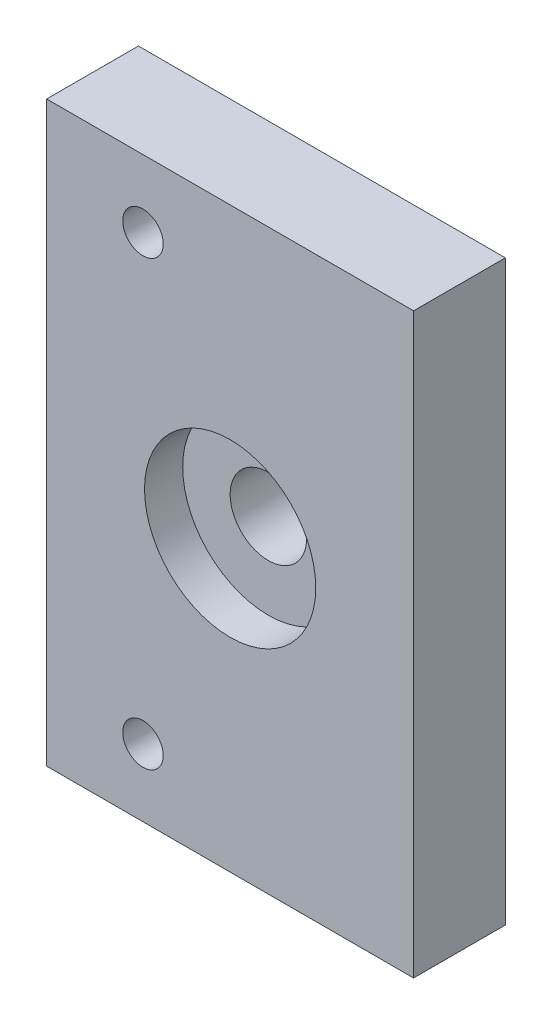
ISO-10303-21;
HEADER;
FILE_DESCRIPTION(('STEP AP214'),'2;1');
FILE_NAME('part.step','',(''),(''),'','','');
FILE_SCHEMA(('AUTOMOTIVE_DESIGN { 1 0 10303 214 1 1 1 1 }'));
ENDSEC;
DATA;
#1=APPLICATION_CONTEXT('core data for automotive mechanical design processes');
#2=APPLICATION_PROTOCOL_DEFINITION('international standard','automotive_design',2000,#1);
#3=PRODUCT_CONTEXT('',#1,'mechanical');
#4=PRODUCT('Part','Part','',(#3));
#5=PRODUCT_RELATED_PRODUCT_CATEGORY('part','',(#4));
#6=PRODUCT_DEFINITION_FORMATION('','',#4);
#7=PRODUCT_DEFINITION_CONTEXT('part definition',#1,'design');
#8=PRODUCT_DEFINITION('design','',#6,#7);
#9=PRODUCT_DEFINITION_SHAPE('','',#8);
#10=(LENGTH_UNIT() NAMED_UNIT(*) SI_UNIT(.MILLI.,.METRE.));
#11=(NAMED_UNIT(*) PLANE_ANGLE_UNIT() SI_UNIT($,.RADIAN.));
#12=(NAMED_UNIT(*) SI_UNIT($,.STERADIAN.) SOLID_ANGLE_UNIT());
#13=UNCERTAINTY_MEASURE_WITH_UNIT(LENGTH_MEASURE(1.E-05),#10,'distance_accuracy_value','');
#14=(GEOMETRIC_REPRESENTATION_CONTEXT(3) GLOBAL_UNCERTAINTY_ASSIGNED_CONTEXT((#13)) GLOBAL_UNIT_ASSIGNED_CONTEXT((#10,
#11,#12)) REPRESENTATION_CONTEXT('',''));
#15=CARTESIAN_POINT('',(0.,0.,0.));
#16=DIRECTION('',(0.,0.,1.));
#17=DIRECTION('',(1.,0.,0.));
#18=AXIS2_PLACEMENT_3D('',#15,#16,#17);
#19=CARTESIAN_POINT('',(0.,-29.9999999999999,5.55752));
#20=DIRECTION('',(0.,1.,0.));
#21=DIRECTION('',(-1.,0.,0.));
#22=AXIS2_PLACEMENT_3D('',#19,#20,#21);
#23=PLANE('',#22);
#24=DIRECTION('',(1.,0.,0.));
#25=VECTOR('',#24,1.);
#26=CARTESIAN_POINT('',(0.,-29.9999999999999,0.));
#27=LINE('',#26,#25);
#28=CARTESIAN_POINT('',(-295.275,-30.,0.));
#29=VERTEX_POINT('',#28);
#30=CARTESIAN_POINT('',(-257.175,-30.,0.));
#31=VERTEX_POINT('',#30);
#32=EDGE_CURVE('E87',#29,#31,#27,.T.);
#33=ORIENTED_EDGE('',*,*,#32,.T.);
#34=DIRECTION('',(0.,0.,-1.));
#35=VECTOR('',#34,1.);
#36=CARTESIAN_POINT('',(-257.175,-30.,5.55752));
#37=LINE('',#36,#35);
#38=CARTESIAN_POINT('',(-257.175,-30.,9.525));
#39=VERTEX_POINT('',#38);
#40=EDGE_CURVE('E44',#39,#31,#37,.T.);
#41=ORIENTED_EDGE('',*,*,#40,.F.);
#42=DIRECTION('',(1.,0.,0.));
#43=VECTOR('',#42,1.);
#44=CARTESIAN_POINT('',(0.,-29.9999999999999,9.525));
#45=LINE('',#44,#43);
#46=CARTESIAN_POINT('',(-295.275,-30.,9.525));
#47=VERTEX_POINT('',#46);
#48=EDGE_CURVE('E85',#47,#39,#45,.T.);
#49=ORIENTED_EDGE('',*,*,#48,.F.);
#50=DIRECTION('',(0.,0.,-1.));
#51=VECTOR('',#50,1.);
#52=CARTESIAN_POINT('',(-295.275,-30.,5.55752));
#53=LINE('',#52,#51);
#54=EDGE_CURVE('E57',#47,#29,#53,.T.);
#55=ORIENTED_EDGE('',*,*,#54,.T.);
#56=EDGE_LOOP('',(#33,#41,#49,#55));
#57=FACE_BOUND('',#56,.T.);
#58=ADVANCED_FACE('F41',(#57),#23,.F.);
#59=CARTESIAN_POINT('',(-257.175,0.,5.55752));
#60=DIRECTION('',(-1.,0.,0.));
#61=DIRECTION('',(0.,0.,1.));
#62=AXIS2_PLACEMENT_3D('',#59,#60,#61);
#63=PLANE('',#62);
#64=DIRECTION('',(0.,1.,0.));
#65=VECTOR('',#64,1.);
#66=CARTESIAN_POINT('',(-257.175,0.,0.));
#67=LINE('',#66,#65);
#68=CARTESIAN_POINT('',(-257.175,30.,0.));
#69=VERTEX_POINT('',#68);
#70=EDGE_CURVE('E124',#31,#69,#67,.T.);
#71=ORIENTED_EDGE('',*,*,#70,.T.);
#72=DIRECTION('',(0.,0.,-1.));
#73=VECTOR('',#72,1.);
#74=CARTESIAN_POINT('',(-257.175,30.,5.55752));
#75=LINE('',#74,#73);
#76=CARTESIAN_POINT('',(-257.175,30.,9.525));
#77=VERTEX_POINT('',#76);
#78=EDGE_CURVE('E91',#77,#69,#75,.T.);
#79=ORIENTED_EDGE('',*,*,#78,.F.);
#80=DIRECTION('',(0.,1.,0.));
#81=VECTOR('',#80,1.);
#82=CARTESIAN_POINT('',(-257.175,0.,9.525));
#83=LINE('',#82,#81);
#84=EDGE_CURVE('E93',#39,#77,#83,.T.);
#85=ORIENTED_EDGE('',*,*,#84,.F.);
#86=ORIENTED_EDGE('',*,*,#40,.T.);
#87=EDGE_LOOP('',(#71,#79,#85,#86));
#88=FACE_BOUND('',#87,.T.);
#89=ADVANCED_FACE('F94',(#88),#63,.F.);
#90=CARTESIAN_POINT('',(0.,30.,5.55752));
#91=DIRECTION('',(0.,1.,0.));
#92=DIRECTION('',(0.,0.,1.));
#93=AXIS2_PLACEMENT_3D('',#90,#91,#92);
#94=PLANE('',#93);
#95=DIRECTION('',(1.,0.,0.));
#96=VECTOR('',#95,1.);
#97=CARTESIAN_POINT('',(0.,30.,0.));
#98=LINE('',#97,#96);
#99=CARTESIAN_POINT('',(-295.275,30.,0.));
#100=VERTEX_POINT('',#99);
#101=EDGE_CURVE('E127',#100,#69,#98,.T.);
#102=ORIENTED_EDGE('',*,*,#101,.F.);
#103=DIRECTION('',(0.,0.,-1.));
#104=VECTOR('',#103,1.);
#105=CARTESIAN_POINT('',(-295.275,30.,5.55752));
#106=LINE('',#105,#104);
#107=CARTESIAN_POINT('',(-295.275,30.,9.525));
#108=VERTEX_POINT('',#107);
#109=EDGE_CURVE('E65',#108,#100,#106,.T.);
#110=ORIENTED_EDGE('',*,*,#109,.F.);
#111=DIRECTION('',(1.,0.,0.));
#112=VECTOR('',#111,1.);
#113=CARTESIAN_POINT('',(0.,30.,9.525));
#114=LINE('',#113,#112);
#115=EDGE_CURVE('E99',#108,#77,#114,.T.);
#116=ORIENTED_EDGE('',*,*,#115,.T.);
#117=ORIENTED_EDGE('',*,*,#78,.T.);
#118=EDGE_LOOP('',(#102,#110,#116,#117));
#119=FACE_BOUND('',#118,.T.);
#120=ADVANCED_FACE('F144',(#119),#94,.T.);
#121=CARTESIAN_POINT('',(-295.275,0.,5.55752));
#122=DIRECTION('',(-1.,0.,0.));
#123=DIRECTION('',(0.,0.,1.));
#124=AXIS2_PLACEMENT_3D('',#121,#122,#123);
#125=PLANE('',#124);
#126=DIRECTION('',(0.,1.,0.));
#127=VECTOR('',#126,1.);
#128=CARTESIAN_POINT('',(-295.275,0.,0.));
#129=LINE('',#128,#127);
#130=EDGE_CURVE('E131',#29,#100,#129,.T.);
#131=ORIENTED_EDGE('',*,*,#130,.F.);
#132=ORIENTED_EDGE('',*,*,#54,.F.);
#133=DIRECTION('',(0.,1.,0.));
#134=VECTOR('',#133,1.);
#135=CARTESIAN_POINT('',(-295.275,0.,9.525));
#136=LINE('',#135,#134);
#137=EDGE_CURVE('E102',#47,#108,#136,.T.);
#138=ORIENTED_EDGE('',*,*,#137,.T.);
#139=ORIENTED_EDGE('',*,*,#109,.T.);
#140=EDGE_LOOP('',(#131,#132,#138,#139));
#141=FACE_BOUND('',#140,.T.);
#142=ADVANCED_FACE('F147',(#141),#125,.T.);
#143=CARTESIAN_POINT('',(-276.225,0.,5.55752));
#144=DIRECTION('',(0.,0.,-1.));
#145=DIRECTION('',(-1.,0.,0.));
#146=AXIS2_PLACEMENT_3D('',#143,#144,#145);
#147=CYLINDRICAL_SURFACE('',#146,3.96875000000005);
#148=CARTESIAN_POINT('',(-276.225,0.,5.55752));
#149=DIRECTION('',(0.,0.,1.));
#150=DIRECTION('',(1.,0.,0.));
#151=AXIS2_PLACEMENT_3D('',#148,#149,#150);
#152=CIRCLE('',#151,3.96875000000005);
#153=CARTESIAN_POINT('',(-280.19375,0.,5.55752));
#154=VERTEX_POINT('',#153);
#155=EDGE_CURVE('E117',#154,#154,#152,.T.);
#156=CARTESIAN_POINT('',(-276.225,0.,0.));
#157=DIRECTION('',(0.,0.,1.));
#158=DIRECTION('',(1.,0.,0.));
#159=AXIS2_PLACEMENT_3D('',#156,#157,#158);
#160=CIRCLE('',#159,3.96875000000005);
#161=CARTESIAN_POINT('',(-280.19375,0.,0.));
#162=VERTEX_POINT('',#161);
#163=EDGE_CURVE('E121',#162,#162,#160,.T.);
#164=CARTESIAN_POINT('',(-280.19375,0.,5.55752));
#165=CARTESIAN_POINT('',(-280.19375,0.,5.49962916666667));
#166=CARTESIAN_POINT('',(-280.19375,0.,5.44173833333333));
#167=CARTESIAN_POINT('',(-280.19375,0.,5.32595666666667));
#168=CARTESIAN_POINT('',(-280.19375,0.,5.26806583333333));
#169=CARTESIAN_POINT('',(-280.19375,0.,5.15228416666667));
#170=CARTESIAN_POINT('',(-280.19375,0.,5.09439333333333));
#171=CARTESIAN_POINT('',(-280.19375,0.,4.97861166666667));
#172=CARTESIAN_POINT('',(-280.19375,0.,4.92072083333333));
#173=CARTESIAN_POINT('',(-280.19375,0.,4.80493916666667));
#174=CARTESIAN_POINT('',(-280.19375,0.,4.74704833333333));
#175=CARTESIAN_POINT('',(-280.19375,0.,4.63126666666667));
#176=CARTESIAN_POINT('',(-280.19375,0.,4.57337583333333));
#177=CARTESIAN_POINT('',(-280.19375,0.,4.45759416666667));
#178=CARTESIAN_POINT('',(-280.19375,0.,4.39970333333333));
#179=CARTESIAN_POINT('',(-280.19375,0.,4.28392166666667));
#180=CARTESIAN_POINT('',(-280.19375,0.,4.22603083333333));
#181=CARTESIAN_POINT('',(-280.19375,0.,4.11024916666667));
#182=CARTESIAN_POINT('',(-280.19375,0.,4.05235833333333));
#183=CARTESIAN_POINT('',(-280.19375,0.,3.93657666666667));
#184=CARTESIAN_POINT('',(-280.19375,0.,3.87868583333333));
#185=CARTESIAN_POINT('',(-280.19375,0.,3.76290416666667));
#186=CARTESIAN_POINT('',(-280.19375,0.,3.70501333333333));
#187=CARTESIAN_POINT('',(-280.19375,0.,3.58923166666667));
#188=CARTESIAN_POINT('',(-280.19375,0.,3.53134083333333));
#189=CARTESIAN_POINT('',(-280.19375,0.,3.41555916666667));
#190=CARTESIAN_POINT('',(-280.19375,0.,3.35766833333333));
#191=CARTESIAN_POINT('',(-280.19375,0.,3.24188666666667));
#192=CARTESIAN_POINT('',(-280.19375,0.,3.18399583333333));
#193=CARTESIAN_POINT('',(-280.19375,0.,3.06821416666667));
#194=CARTESIAN_POINT('',(-280.19375,0.,3.01032333333333));
#195=CARTESIAN_POINT('',(-280.19375,0.,2.89454166666667));
#196=CARTESIAN_POINT('',(-280.19375,0.,2.83665083333333));
#197=CARTESIAN_POINT('',(-280.19375,0.,2.72086916666667));
#198=CARTESIAN_POINT('',(-280.19375,0.,2.66297833333333));
#199=CARTESIAN_POINT('',(-280.19375,0.,2.54719666666667));
#200=CARTESIAN_POINT('',(-280.19375,0.,2.48930583333333));
#201=CARTESIAN_POINT('',(-280.19375,0.,2.37352416666667));
#202=CARTESIAN_POINT('',(-280.19375,0.,2.31563333333333));
#203=CARTESIAN_POINT('',(-280.19375,0.,2.19985166666667));
#204=CARTESIAN_POINT('',(-280.19375,0.,2.14196083333333));
#205=CARTESIAN_POINT('',(-280.19375,0.,2.02617916666667));
#206=CARTESIAN_POINT('',(-280.19375,0.,1.96828833333333));
#207=CARTESIAN_POINT('',(-280.19375,0.,1.85250666666667));
#208=CARTESIAN_POINT('',(-280.19375,0.,1.79461583333333));
#209=CARTESIAN_POINT('',(-280.19375,0.,1.67883416666667));
#210=CARTESIAN_POINT('',(-280.19375,0.,1.62094333333333));
#211=CARTESIAN_POINT('',(-280.19375,0.,1.50516166666667));
#212=CARTESIAN_POINT('',(-280.19375,0.,1.44727083333333));
#213=CARTESIAN_POINT('',(-280.19375,0.,1.33148916666667));
#214=CARTESIAN_POINT('',(-280.19375,0.,1.27359833333333));
#215=CARTESIAN_POINT('',(-280.19375,0.,1.15781666666667));
#216=CARTESIAN_POINT('',(-280.19375,0.,1.09992583333333));
#217=CARTESIAN_POINT('',(-280.19375,0.,0.984144166666666));
#218=CARTESIAN_POINT('',(-280.19375,0.,0.926253333333332));
#219=CARTESIAN_POINT('',(-280.19375,0.,0.810471666666666));
#220=CARTESIAN_POINT('',(-280.19375,0.,0.752580833333333));
#221=CARTESIAN_POINT('',(-280.19375,0.,0.636799166666666));
#222=CARTESIAN_POINT('',(-280.19375,0.,0.578908333333333));
#223=CARTESIAN_POINT('',(-280.19375,0.,0.463126666666666));
#224=CARTESIAN_POINT('',(-280.19375,0.,0.405235833333332));
#225=CARTESIAN_POINT('',(-280.19375,0.,0.289454166666666));
#226=CARTESIAN_POINT('',(-280.19375,0.,0.231563333333333));
#227=CARTESIAN_POINT('',(-280.19375,0.,0.115781666666666));
#228=CARTESIAN_POINT('',(-280.19375,0.,0.0578908333333326));
#229=CARTESIAN_POINT('',(-280.19375,0.,0.));
#230=B_SPLINE_CURVE_WITH_KNOTS('',3,(#164,#165,#166,#167,#168,#169,#170,#171,#172,#173,#174,
#175,#176,#177,#178,#179,#180,#181,#182,#183,#184,#185,#186,#187,#188,#189,#190,#191,#192,#193,
#194,#195,#196,#197,#198,#199,#200,#201,#202,#203,#204,#205,#206,#207,#208,#209,#210,#211,#212,
#213,#214,#215,#216,#217,#218,#219,#220,#221,#222,#223,#224,#225,#226,#227,#228,#229),
.UNSPECIFIED.,.F.,.F.,(4,2,2,2,2,2,2,2,2,2,2,2,2,2,2,2,2,2,2,2,2,2,2,2,2,2,2,2,2,2,2,2,4),(0.,
0.1736725,0.347345000000001,0.5210175,0.69469,0.868362500000001,1.042035,1.2157075,1.38938,
1.5630525,1.736725,1.9103975,2.08407,2.2577425,2.431415,2.6050875,2.77876,2.9524325,3.126105,
3.2997775,3.47345,3.6471225,3.820795,3.9944675,4.16814,4.3418125,4.515485,4.6891575,4.86283,
5.0365025,5.210175,5.3838475,5.55752),.UNSPECIFIED.);
#231=EDGE_CURVE('BSEAM149',#154,#162,#230,.T.);
#232=ORIENTED_EDGE('',*,*,#155,.T.);
#233=ORIENTED_EDGE('',*,*,#163,.F.);
#234=ORIENTED_EDGE('',*,*,#231,.T.);
#235=ORIENTED_EDGE('',*,*,#231,.F.);
#236=EDGE_LOOP('',(#232,#234,#233,#235));
#237=FACE_BOUND('',#236,.T.);
#238=ADVANCED_FACE('F149',(#237),#147,.F.);
#239=CARTESIAN_POINT('',(0.,0.,5.55752));
#240=DIRECTION('',(0.,0.,1.));
#241=DIRECTION('',(1.,0.,0.));
#242=AXIS2_PLACEMENT_3D('',#239,#240,#241);
#243=PLANE('',#242);
#244=CARTESIAN_POINT('',(-276.225,0.,5.55752));
#245=DIRECTION('',(0.,0.,1.));
#246=DIRECTION('',(1.,0.,0.));
#247=AXIS2_PLACEMENT_3D('',#244,#245,#246);
#248=CIRCLE('',#247,8.89000000000001);
#249=CARTESIAN_POINT('',(-285.115,0.,5.55752));
#250=VERTEX_POINT('',#249);
#251=EDGE_CURVE('E11',#250,#250,#248,.F.);
#252=ORIENTED_EDGE('',*,*,#251,.F.);
#253=EDGE_LOOP('',(#252));
#254=FACE_BOUND('',#253,.T.);
#255=ORIENTED_EDGE('',*,*,#155,.F.);
#256=EDGE_LOOP('',(#255));
#257=FACE_BOUND('',#256,.T.);
#258=ADVANCED_FACE('F155',(#254,#257),#243,.T.);
#259=CARTESIAN_POINT('',(0.,0.,0.));
#260=DIRECTION('',(0.,0.,1.));
#261=DIRECTION('',(1.,0.,0.));
#262=AXIS2_PLACEMENT_3D('',#259,#260,#261);
#263=PLANE('',#262);
#264=CARTESIAN_POINT('',(-285.275,23.,0.));
#265=DIRECTION('',(0.,0.,1.));
#266=DIRECTION('',(1.,0.,0.));
#267=AXIS2_PLACEMENT_3D('',#264,#265,#266);
#268=CIRCLE('',#267,2.09999999999999);
#269=CARTESIAN_POINT('',(-283.175,23.,0.));
#270=VERTEX_POINT('',#269);
#271=EDGE_CURVE('E109',#270,#270,#268,.F.);
#272=ORIENTED_EDGE('',*,*,#271,.F.);
#273=EDGE_LOOP('',(#272));
#274=FACE_BOUND('',#273,.T.);
#275=CARTESIAN_POINT('',(-285.275,-23.,0.));
#276=DIRECTION('',(0.,0.,1.));
#277=DIRECTION('',(1.,0.,0.));
#278=AXIS2_PLACEMENT_3D('',#275,#276,#277);
#279=CIRCLE('',#278,2.09999999999999);
#280=CARTESIAN_POINT('',(-283.175,-23.,0.));
#281=VERTEX_POINT('',#280);
#282=EDGE_CURVE('E278',#281,#281,#279,.F.);
#283=ORIENTED_EDGE('',*,*,#282,.F.);
#284=EDGE_LOOP('',(#283));
#285=FACE_BOUND('',#284,.T.);
#286=ORIENTED_EDGE('',*,*,#163,.T.);
#287=EDGE_LOOP('',(#286));
#288=FACE_BOUND('',#287,.T.);
#289=ORIENTED_EDGE('',*,*,#32,.F.);
#290=ORIENTED_EDGE('',*,*,#130,.T.);
#291=ORIENTED_EDGE('',*,*,#101,.T.);
#292=ORIENTED_EDGE('',*,*,#70,.F.);
#293=EDGE_LOOP('',(#289,#290,#291,#292));
#294=FACE_BOUND('',#293,.T.);
#295=ADVANCED_FACE('F146',(#274,#285,#288,#294),#263,.F.);
#296=CARTESIAN_POINT('',(-276.225,0.,9.525));
#297=DIRECTION('',(0.,0.,-1.));
#298=DIRECTION('',(-1.,0.,0.));
#299=AXIS2_PLACEMENT_3D('',#296,#297,#298);
#300=CYLINDRICAL_SURFACE('',#299,8.89000000000001);
#301=CARTESIAN_POINT('',(-276.225,0.,9.525));
#302=DIRECTION('',(0.,0.,1.));
#303=DIRECTION('',(1.,0.,0.));
#304=AXIS2_PLACEMENT_3D('',#301,#302,#303);
#305=CIRCLE('',#304,8.89000000000001);
#306=CARTESIAN_POINT('',(-285.115,0.,9.525));
#307=VERTEX_POINT('',#306);
#308=EDGE_CURVE('E104',#307,#307,#305,.T.);
#309=CARTESIAN_POINT('',(-285.115,0.,5.55752));
#310=CARTESIAN_POINT('',(-285.115,0.,5.59884791666667));
#311=CARTESIAN_POINT('',(-285.115,0.,5.64017583333333));
#312=CARTESIAN_POINT('',(-285.115,0.,5.72283166666667));
#313=CARTESIAN_POINT('',(-285.115,0.,5.76415958333333));
#314=CARTESIAN_POINT('',(-285.115,0.,5.84681541666667));
#315=CARTESIAN_POINT('',(-285.115,0.,5.88814333333333));
#316=CARTESIAN_POINT('',(-285.115,0.,5.97079916666667));
#317=CARTESIAN_POINT('',(-285.115,0.,6.01212708333333));
#318=CARTESIAN_POINT('',(-285.115,0.,6.09478291666667));
#319=CARTESIAN_POINT('',(-285.115,0.,6.13611083333333));
#320=CARTESIAN_POINT('',(-285.115,0.,6.21876666666667));
#321=CARTESIAN_POINT('',(-285.115,0.,6.26009458333333));
#322=CARTESIAN_POINT('',(-285.115,0.,6.34275041666667));
#323=CARTESIAN_POINT('',(-285.115,0.,6.38407833333333));
#324=CARTESIAN_POINT('',(-285.115,0.,6.46673416666667));
#325=CARTESIAN_POINT('',(-285.115,0.,6.50806208333333));
#326=CARTESIAN_POINT('',(-285.115,0.,6.59071791666667));
#327=CARTESIAN_POINT('',(-285.115,0.,6.63204583333333));
#328=CARTESIAN_POINT('',(-285.115,0.,6.71470166666667));
#329=CARTESIAN_POINT('',(-285.115,0.,6.75602958333333));
#330=CARTESIAN_POINT('',(-285.115,0.,6.83868541666667));
#331=CARTESIAN_POINT('',(-285.115,0.,6.88001333333333));
#332=CARTESIAN_POINT('',(-285.115,0.,6.96266916666667));
#333=CARTESIAN_POINT('',(-285.115,0.,7.00399708333333));
#334=CARTESIAN_POINT('',(-285.115,0.,7.08665291666667));
#335=CARTESIAN_POINT('',(-285.115,0.,7.12798083333333));
#336=CARTESIAN_POINT('',(-285.115,0.,7.21063666666667));
#337=CARTESIAN_POINT('',(-285.115,0.,7.25196458333333));
#338=CARTESIAN_POINT('',(-285.115,0.,7.33462041666667));
#339=CARTESIAN_POINT('',(-285.115,0.,7.37594833333333));
#340=CARTESIAN_POINT('',(-285.115,0.,7.45860416666667));
#341=CARTESIAN_POINT('',(-285.115,0.,7.49993208333333));
#342=CARTESIAN_POINT('',(-285.115,0.,7.58258791666667));
#343=CARTESIAN_POINT('',(-285.115,0.,7.62391583333333));
#344=CARTESIAN_POINT('',(-285.115,0.,7.70657166666667));
#345=CARTESIAN_POINT('',(-285.115,0.,7.74789958333333));
#346=CARTESIAN_POINT('',(-285.115,0.,7.83055541666667));
#347=CARTESIAN_POINT('',(-285.115,0.,7.87188333333333));
#348=CARTESIAN_POINT('',(-285.115,0.,7.95453916666667));
#349=CARTESIAN_POINT('',(-285.115,0.,7.99586708333333));
#350=CARTESIAN_POINT('',(-285.115,0.,8.07852291666667));
#351=CARTESIAN_POINT('',(-285.115,0.,8.11985083333333));
#352=CARTESIAN_POINT('',(-285.115,0.,8.20250666666667));
#353=CARTESIAN_POINT('',(-285.115,0.,8.24383458333333));
#354=CARTESIAN_POINT('',(-285.115,0.,8.32649041666667));
#355=CARTESIAN_POINT('',(-285.115,0.,8.36781833333333));
#356=CARTESIAN_POINT('',(-285.115,0.,8.45047416666667));
#357=CARTESIAN_POINT('',(-285.115,0.,8.49180208333333));
#358=CARTESIAN_POINT('',(-285.115,0.,8.57445791666667));
#359=CARTESIAN_POINT('',(-285.115,0.,8.61578583333333));
#360=CARTESIAN_POINT('',(-285.115,0.,8.69844166666667));
#361=CARTESIAN_POINT('',(-285.115,0.,8.73976958333333));
#362=CARTESIAN_POINT('',(-285.115,0.,8.82242541666667));
#363=CARTESIAN_POINT('',(-285.115,0.,8.86375333333333));
#364=CARTESIAN_POINT('',(-285.115,0.,8.94640916666667));
#365=CARTESIAN_POINT('',(-285.115,0.,8.98773708333333));
#366=CARTESIAN_POINT('',(-285.115,0.,9.07039291666667));
#367=CARTESIAN_POINT('',(-285.115,0.,9.11172083333333));
#368=CARTESIAN_POINT('',(-285.115,0.,9.19437666666667));
#369=CARTESIAN_POINT('',(-285.115,0.,9.23570458333333));
#370=CARTESIAN_POINT('',(-285.115,0.,9.31836041666667));
#371=CARTESIAN_POINT('',(-285.115,0.,9.35968833333333));
#372=CARTESIAN_POINT('',(-285.115,0.,9.44234416666667));
#373=CARTESIAN_POINT('',(-285.115,0.,9.48367208333333));
#374=CARTESIAN_POINT('',(-285.115,0.,9.525));
#375=B_SPLINE_CURVE_WITH_KNOTS('',3,(#309,#310,#311,#312,#313,#314,#315,#316,#317,#318,#319,
#320,#321,#322,#323,#324,#325,#326,#327,#328,#329,#330,#331,#332,#333,#334,#335,#336,#337,#338,
#339,#340,#341,#342,#343,#344,#345,#346,#347,#348,#349,#350,#351,#352,#353,#354,#355,#356,#357,
#358,#359,#360,#361,#362,#363,#364,#365,#366,#367,#368,#369,#370,#371,#372,#373,#374),
.UNSPECIFIED.,.F.,.F.,(4,2,2,2,2,2,2,2,2,2,2,2,2,2,2,2,2,2,2,2,2,2,2,2,2,2,2,2,2,2,2,2,4),(0.,
0.12398375,0.2479675,0.37195125,0.495935,0.619918749999999,0.7439025,0.86788625,0.99187,
1.11585375,1.2398375,1.36382125,1.487805,1.61178875,1.7357725,1.85975625,1.98374,2.10772375,
2.2317075,2.35569125,2.479675,2.60365875,2.7276425,2.85162625,2.97561,3.09959375,3.2235775,
3.34756125,3.471545,3.59552875,3.7195125,3.84349625,3.96748),.UNSPECIFIED.);
#376=EDGE_CURVE('BSEAM209',#250,#307,#375,.T.);
#377=ORIENTED_EDGE('',*,*,#251,.T.);
#378=ORIENTED_EDGE('',*,*,#308,.T.);
#379=ORIENTED_EDGE('',*,*,#376,.T.);
#380=ORIENTED_EDGE('',*,*,#376,.F.);
#381=EDGE_LOOP('',(#377,#379,#378,#380));
#382=FACE_BOUND('',#381,.T.);
#383=ADVANCED_FACE('F209',(#382),#300,.F.);
#384=CARTESIAN_POINT('',(0.,0.,9.525));
#385=DIRECTION('',(0.,0.,1.));
#386=DIRECTION('',(1.,0.,0.));
#387=AXIS2_PLACEMENT_3D('',#384,#385,#386);
#388=PLANE('',#387);
#389=CARTESIAN_POINT('',(-285.275,23.,9.525));
#390=DIRECTION('',(0.,0.,1.));
#391=DIRECTION('',(1.,0.,0.));
#392=AXIS2_PLACEMENT_3D('',#389,#390,#391);
#393=CIRCLE('',#392,2.09999999999999);
#394=CARTESIAN_POINT('',(-283.175,23.,9.525));
#395=VERTEX_POINT('',#394);
#396=EDGE_CURVE('E269',#395,#395,#393,.T.);
#397=ORIENTED_EDGE('',*,*,#396,.F.);
#398=EDGE_LOOP('',(#397));
#399=FACE_BOUND('',#398,.T.);
#400=CARTESIAN_POINT('',(-285.275,-23.,9.525));
#401=DIRECTION('',(0.,0.,1.));
#402=DIRECTION('',(-1.,0.,0.));
#403=AXIS2_PLACEMENT_3D('',#400,#401,#402);
#404=CIRCLE('',#403,2.09999999999999);
#405=CARTESIAN_POINT('',(-287.375,-23.,9.525));
#406=VERTEX_POINT('',#405);
#407=EDGE_CURVE('E271',#406,#406,#404,.T.);
#408=ORIENTED_EDGE('',*,*,#407,.F.);
#409=EDGE_LOOP('',(#408));
#410=FACE_BOUND('',#409,.T.);
#411=ORIENTED_EDGE('',*,*,#308,.F.);
#412=EDGE_LOOP('',(#411));
#413=FACE_BOUND('',#412,.T.);
#414=ORIENTED_EDGE('',*,*,#48,.T.);
#415=ORIENTED_EDGE('',*,*,#84,.T.);
#416=ORIENTED_EDGE('',*,*,#115,.F.);
#417=ORIENTED_EDGE('',*,*,#137,.F.);
#418=EDGE_LOOP('',(#414,#415,#416,#417));
#419=FACE_BOUND('',#418,.T.);
#420=ADVANCED_FACE('F101',(#399,#410,#413,#419),#388,.T.);
#421=CARTESIAN_POINT('',(-285.275,-23.,-5.93969696196697));
#422=DIRECTION('',(0.,0.,1.));
#423=DIRECTION('',(1.,0.,0.));
#424=AXIS2_PLACEMENT_3D('',#421,#422,#423);
#425=CYLINDRICAL_SURFACE('',#424,2.09999999999999);
#426=ORIENTED_EDGE('',*,*,#282,.T.);
#427=EDGE_LOOP('',(#426));
#428=FACE_BOUND('',#427,.T.);
#429=ORIENTED_EDGE('',*,*,#407,.T.);
#430=EDGE_LOOP('',(#429));
#431=FACE_BOUND('',#430,.T.);
#432=ADVANCED_FACE('F229',(#428,#431),#425,.F.);
#433=CARTESIAN_POINT('',(-285.275,23.,-5.93969696196697));
#434=DIRECTION('',(0.,0.,1.));
#435=DIRECTION('',(1.,0.,0.));
#436=AXIS2_PLACEMENT_3D('',#433,#434,#435);
#437=CYLINDRICAL_SURFACE('',#436,2.09999999999999);
#438=ORIENTED_EDGE('',*,*,#271,.T.);
#439=EDGE_LOOP('',(#438));
#440=FACE_BOUND('',#439,.T.);
#441=ORIENTED_EDGE('',*,*,#396,.T.);
#442=EDGE_LOOP('',(#441));
#443=FACE_BOUND('',#442,.T.);
#444=ADVANCED_FACE('F238',(#440,#443),#437,.F.);
#445=CLOSED_SHELL('',(#58,#89,#120,#142,#238,#258,#295,#383,#420,#432,#444));
#446=MANIFOLD_SOLID_BREP('B2',#445);
#447=ADVANCED_BREP_SHAPE_REPRESENTATION('',(#18,#446),#14);
#448=SHAPE_DEFINITION_REPRESENTATION(#9,#447);
ENDSEC;
END-ISO-10303-21;
